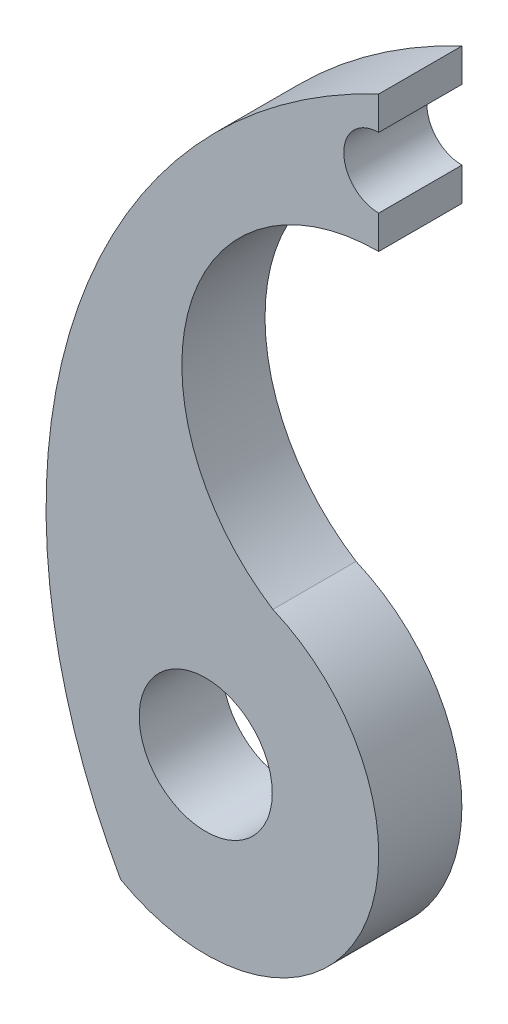
ISO-10303-21;
HEADER;
FILE_DESCRIPTION(('STEP AP214'),'2;1');
FILE_NAME('part.step','',(''),(''),'','','');
FILE_SCHEMA(('AUTOMOTIVE_DESIGN { 1 0 10303 214 1 1 1 1 }'));
ENDSEC;
DATA;
#1=APPLICATION_CONTEXT('core data for automotive mechanical design processes');
#2=APPLICATION_PROTOCOL_DEFINITION('international standard','automotive_design',2000,#1);
#3=PRODUCT_CONTEXT('',#1,'mechanical');
#4=PRODUCT('Part','Part','',(#3));
#5=PRODUCT_RELATED_PRODUCT_CATEGORY('part','',(#4));
#6=PRODUCT_DEFINITION_FORMATION('','',#4);
#7=PRODUCT_DEFINITION_CONTEXT('part definition',#1,'design');
#8=PRODUCT_DEFINITION('design','',#6,#7);
#9=PRODUCT_DEFINITION_SHAPE('','',#8);
#10=(LENGTH_UNIT() NAMED_UNIT(*) SI_UNIT(.MILLI.,.METRE.));
#11=(NAMED_UNIT(*) PLANE_ANGLE_UNIT() SI_UNIT($,.RADIAN.));
#12=(NAMED_UNIT(*) SI_UNIT($,.STERADIAN.) SOLID_ANGLE_UNIT());
#13=UNCERTAINTY_MEASURE_WITH_UNIT(LENGTH_MEASURE(1.E-05),#10,'distance_accuracy_value','');
#14=(GEOMETRIC_REPRESENTATION_CONTEXT(3) GLOBAL_UNCERTAINTY_ASSIGNED_CONTEXT((#13)) GLOBAL_UNIT_ASSIGNED_CONTEXT((#10,
#11,#12)) REPRESENTATION_CONTEXT('',''));
#15=CARTESIAN_POINT('',(0.,0.,0.));
#16=DIRECTION('',(0.,0.,1.));
#17=DIRECTION('',(1.,0.,0.));
#18=AXIS2_PLACEMENT_3D('',#15,#16,#17);
#19=CARTESIAN_POINT('',(9.45278155463974,11.7152638777585,3.175));
#20=DIRECTION('',(0.,0.,1.));
#21=DIRECTION('',(1.,0.,0.));
#22=AXIS2_PLACEMENT_3D('',#19,#20,#21);
#23=PLANE('',#22);
#24=CARTESIAN_POINT('',(9.45278155463974,11.7152638777585,3.175));
#25=DIRECTION('',(0.,0.,1.));
#26=DIRECTION('',(1.,0.,0.));
#27=AXIS2_PLACEMENT_3D('',#24,#25,#26);
#28=CIRCLE('',#27,22.1527815546397);
#29=CARTESIAN_POINT('',(0.,31.75,3.175));
#30=VERTEX_POINT('',#29);
#31=CARTESIAN_POINT('',(-9.85589421673466,0.856130829327474,3.175));
#32=VERTEX_POINT('',#31);
#33=EDGE_CURVE('E128',#30,#32,#28,.T.);
#34=ORIENTED_EDGE('',*,*,#33,.T.);
#35=CARTESIAN_POINT('',(-6.604,6.604,3.175));
#36=DIRECTION('',(0.,0.,1.));
#37=DIRECTION('',(1.,0.,0.));
#38=AXIS2_PLACEMENT_3D('',#35,#36,#37);
#39=CIRCLE('',#38,6.604);
#40=CARTESIAN_POINT('',(-4.04044583348446,12.6901322722515,3.175));
#41=VERTEX_POINT('',#40);
#42=EDGE_CURVE('E86',#32,#41,#39,.T.);
#43=ORIENTED_EDGE('',*,*,#42,.T.);
#44=CARTESIAN_POINT('',(0.,19.0273306487825,3.175));
#45=DIRECTION('',(0.,0.,-1.));
#46=DIRECTION('',(1.,0.,0.));
#47=AXIS2_PLACEMENT_3D('',#44,#45,#46);
#48=CIRCLE('',#47,7.51566935121748);
#49=CARTESIAN_POINT('',(0.,26.543,3.175));
#50=VERTEX_POINT('',#49);
#51=EDGE_CURVE('E99',#41,#50,#48,.T.);
#52=ORIENTED_EDGE('',*,*,#51,.T.);
#53=DIRECTION('',(0.,1.,0.));
#54=VECTOR('',#53,1.);
#55=CARTESIAN_POINT('',(0.,27.813,3.175));
#56=LINE('',#55,#54);
#57=CARTESIAN_POINT('',(0.,27.813,3.175));
#58=VERTEX_POINT('',#57);
#59=EDGE_CURVE('E93',#50,#58,#56,.T.);
#60=ORIENTED_EDGE('',*,*,#59,.T.);
#61=CARTESIAN_POINT('',(0.,29.1465,3.175));
#62=DIRECTION('',(0.,0.,-1.));
#63=DIRECTION('',(1.,0.,0.));
#64=AXIS2_PLACEMENT_3D('',#61,#62,#63);
#65=CIRCLE('',#64,1.3335);
#66=CARTESIAN_POINT('',(0.,30.48,3.175));
#67=VERTEX_POINT('',#66);
#68=EDGE_CURVE('E97',#58,#67,#65,.T.);
#69=ORIENTED_EDGE('',*,*,#68,.T.);
#70=DIRECTION('',(0.,1.,0.));
#71=VECTOR('',#70,1.);
#72=CARTESIAN_POINT('',(0.,30.48,3.175));
#73=LINE('',#72,#71);
#74=EDGE_CURVE('E49',#67,#30,#73,.T.);
#75=ORIENTED_EDGE('',*,*,#74,.T.);
#76=EDGE_LOOP('',(#34,#43,#52,#60,#69,#75));
#77=FACE_BOUND('',#76,.T.);
#78=CARTESIAN_POINT('',(-6.604,6.604,3.175));
#79=DIRECTION('',(0.,0.,1.));
#80=DIRECTION('',(1.,0.,0.));
#81=AXIS2_PLACEMENT_3D('',#78,#79,#80);
#82=CIRCLE('',#81,2.54);
#83=CARTESIAN_POINT('',(-4.064,6.604,3.175));
#84=VERTEX_POINT('',#83);
#85=EDGE_CURVE('E121',#84,#84,#82,.T.);
#86=ORIENTED_EDGE('',*,*,#85,.F.);
#87=EDGE_LOOP('',(#86));
#88=FACE_BOUND('',#87,.T.);
#89=ADVANCED_FACE('F32',(#77,#88),#23,.T.);
#90=CARTESIAN_POINT('',(9.45278155463974,11.7152638777585,0.));
#91=DIRECTION('',(0.,0.,1.));
#92=DIRECTION('',(1.,0.,0.));
#93=AXIS2_PLACEMENT_3D('',#90,#91,#92);
#94=PLANE('',#93);
#95=CARTESIAN_POINT('',(9.45278155463974,11.7152638777585,0.));
#96=DIRECTION('',(0.,0.,1.));
#97=DIRECTION('',(1.,0.,0.));
#98=AXIS2_PLACEMENT_3D('',#95,#96,#97);
#99=CIRCLE('',#98,22.1527815546397);
#100=CARTESIAN_POINT('',(0.,31.75,0.));
#101=VERTEX_POINT('',#100);
#102=CARTESIAN_POINT('',(-9.85589421673466,0.856130829327474,0.));
#103=VERTEX_POINT('',#102);
#104=EDGE_CURVE('E117',#101,#103,#99,.T.);
#105=ORIENTED_EDGE('',*,*,#104,.F.);
#106=DIRECTION('',(0.,1.,0.));
#107=VECTOR('',#106,1.);
#108=CARTESIAN_POINT('',(0.,30.48,0.));
#109=LINE('',#108,#107);
#110=CARTESIAN_POINT('',(0.,30.48,0.));
#111=VERTEX_POINT('',#110);
#112=EDGE_CURVE('E78',#111,#101,#109,.T.);
#113=ORIENTED_EDGE('',*,*,#112,.F.);
#114=CARTESIAN_POINT('',(0.,29.1465,0.));
#115=DIRECTION('',(0.,0.,-1.));
#116=DIRECTION('',(1.,0.,0.));
#117=AXIS2_PLACEMENT_3D('',#114,#115,#116);
#118=CIRCLE('',#117,1.3335);
#119=CARTESIAN_POINT('',(0.,27.813,0.));
#120=VERTEX_POINT('',#119);
#121=EDGE_CURVE('E72',#120,#111,#118,.T.);
#122=ORIENTED_EDGE('',*,*,#121,.F.);
#123=DIRECTION('',(0.,1.,0.));
#124=VECTOR('',#123,1.);
#125=CARTESIAN_POINT('',(0.,27.813,0.));
#126=LINE('',#125,#124);
#127=CARTESIAN_POINT('',(0.,26.543,0.));
#128=VERTEX_POINT('',#127);
#129=EDGE_CURVE('E107',#128,#120,#126,.T.);
#130=ORIENTED_EDGE('',*,*,#129,.F.);
#131=CARTESIAN_POINT('',(0.,19.0273306487825,0.));
#132=DIRECTION('',(0.,0.,-1.));
#133=DIRECTION('',(1.,0.,0.));
#134=AXIS2_PLACEMENT_3D('',#131,#132,#133);
#135=CIRCLE('',#134,7.51566935121748);
#136=CARTESIAN_POINT('',(-4.04044583348446,12.6901322722515,0.));
#137=VERTEX_POINT('',#136);
#138=EDGE_CURVE('E123',#137,#128,#135,.T.);
#139=ORIENTED_EDGE('',*,*,#138,.F.);
#140=CARTESIAN_POINT('',(-6.604,6.604,0.));
#141=DIRECTION('',(0.,0.,1.));
#142=DIRECTION('',(1.,0.,0.));
#143=AXIS2_PLACEMENT_3D('',#140,#141,#142);
#144=CIRCLE('',#143,6.604);
#145=EDGE_CURVE('E120',#103,#137,#144,.T.);
#146=ORIENTED_EDGE('',*,*,#145,.F.);
#147=EDGE_LOOP('',(#105,#113,#122,#130,#139,#146));
#148=FACE_BOUND('',#147,.T.);
#149=CARTESIAN_POINT('',(-6.604,6.604,0.));
#150=DIRECTION('',(0.,0.,1.));
#151=DIRECTION('',(1.,0.,0.));
#152=AXIS2_PLACEMENT_3D('',#149,#150,#151);
#153=CIRCLE('',#152,2.54);
#154=CARTESIAN_POINT('',(-4.064,6.604,0.));
#155=VERTEX_POINT('',#154);
#156=EDGE_CURVE('E221',#155,#155,#153,.T.);
#157=ORIENTED_EDGE('',*,*,#156,.T.);
#158=EDGE_LOOP('',(#157));
#159=FACE_BOUND('',#158,.T.);
#160=ADVANCED_FACE('F137',(#148,#159),#94,.F.);
#161=CARTESIAN_POINT('',(9.45278155463974,11.7152638777585,3.175));
#162=DIRECTION('',(0.,0.,-1.));
#163=DIRECTION('',(-1.,0.,0.));
#164=AXIS2_PLACEMENT_3D('',#161,#162,#163);
#165=CYLINDRICAL_SURFACE('',#164,22.1527815546397);
#166=ORIENTED_EDGE('',*,*,#104,.T.);
#167=DIRECTION('',(0.,0.,-1.));
#168=VECTOR('',#167,1.);
#169=CARTESIAN_POINT('',(-9.85589421673466,0.856130829327474,3.175));
#170=LINE('',#169,#168);
#171=EDGE_CURVE('E11',#32,#103,#170,.T.);
#172=ORIENTED_EDGE('',*,*,#171,.F.);
#173=ORIENTED_EDGE('',*,*,#33,.F.);
#174=DIRECTION('',(0.,0.,-1.));
#175=VECTOR('',#174,1.);
#176=CARTESIAN_POINT('',(0.,31.75,3.175));
#177=LINE('',#176,#175);
#178=EDGE_CURVE('E113',#30,#101,#177,.T.);
#179=ORIENTED_EDGE('',*,*,#178,.T.);
#180=EDGE_LOOP('',(#166,#172,#173,#179));
#181=FACE_BOUND('',#180,.T.);
#182=ADVANCED_FACE('F34',(#181),#165,.T.);
#183=CARTESIAN_POINT('',(-6.604,6.604,3.175));
#184=DIRECTION('',(0.,0.,-1.));
#185=DIRECTION('',(-1.,0.,0.));
#186=AXIS2_PLACEMENT_3D('',#183,#184,#185);
#187=CYLINDRICAL_SURFACE('',#186,6.604);
#188=ORIENTED_EDGE('',*,*,#145,.T.);
#189=DIRECTION('',(0.,0.,-1.));
#190=VECTOR('',#189,1.);
#191=CARTESIAN_POINT('',(-4.04044583348446,12.6901322722515,3.175));
#192=LINE('',#191,#190);
#193=EDGE_CURVE('E41',#41,#137,#192,.T.);
#194=ORIENTED_EDGE('',*,*,#193,.F.);
#195=ORIENTED_EDGE('',*,*,#42,.F.);
#196=ORIENTED_EDGE('',*,*,#171,.T.);
#197=EDGE_LOOP('',(#188,#194,#195,#196));
#198=FACE_BOUND('',#197,.T.);
#199=ADVANCED_FACE('F162',(#198),#187,.T.);
#200=CARTESIAN_POINT('',(0.,19.0273306487825,3.175));
#201=DIRECTION('',(0.,0.,-1.));
#202=DIRECTION('',(-1.,0.,0.));
#203=AXIS2_PLACEMENT_3D('',#200,#201,#202);
#204=CYLINDRICAL_SURFACE('',#203,7.51566935121748);
#205=ORIENTED_EDGE('',*,*,#138,.T.);
#206=DIRECTION('',(0.,0.,-1.));
#207=VECTOR('',#206,1.);
#208=CARTESIAN_POINT('',(0.,26.543,3.175));
#209=LINE('',#208,#207);
#210=EDGE_CURVE('E108',#50,#128,#209,.T.);
#211=ORIENTED_EDGE('',*,*,#210,.F.);
#212=ORIENTED_EDGE('',*,*,#51,.F.);
#213=ORIENTED_EDGE('',*,*,#193,.T.);
#214=EDGE_LOOP('',(#205,#211,#212,#213));
#215=FACE_BOUND('',#214,.T.);
#216=ADVANCED_FACE('F134',(#215),#204,.F.);
#217=CARTESIAN_POINT('',(0.,27.813,3.175));
#218=DIRECTION('',(-1.,0.,0.));
#219=DIRECTION('',(0.,0.,1.));
#220=AXIS2_PLACEMENT_3D('',#217,#218,#219);
#221=PLANE('',#220);
#222=ORIENTED_EDGE('',*,*,#129,.T.);
#223=DIRECTION('',(0.,0.,-1.));
#224=VECTOR('',#223,1.);
#225=CARTESIAN_POINT('',(0.,27.813,3.175));
#226=LINE('',#225,#224);
#227=EDGE_CURVE('E104',#58,#120,#226,.T.);
#228=ORIENTED_EDGE('',*,*,#227,.F.);
#229=ORIENTED_EDGE('',*,*,#59,.F.);
#230=ORIENTED_EDGE('',*,*,#210,.T.);
#231=EDGE_LOOP('',(#222,#228,#229,#230));
#232=FACE_BOUND('',#231,.T.);
#233=ADVANCED_FACE('F105',(#232),#221,.F.);
#234=CARTESIAN_POINT('',(0.,29.1465,3.175));
#235=DIRECTION('',(0.,0.,-1.));
#236=DIRECTION('',(-1.,0.,0.));
#237=AXIS2_PLACEMENT_3D('',#234,#235,#236);
#238=CYLINDRICAL_SURFACE('',#237,1.3335);
#239=ORIENTED_EDGE('',*,*,#121,.T.);
#240=DIRECTION('',(0.,0.,-1.));
#241=VECTOR('',#240,1.);
#242=CARTESIAN_POINT('',(0.,30.48,3.175));
#243=LINE('',#242,#241);
#244=EDGE_CURVE('E109',#67,#111,#243,.T.);
#245=ORIENTED_EDGE('',*,*,#244,.F.);
#246=ORIENTED_EDGE('',*,*,#68,.F.);
#247=ORIENTED_EDGE('',*,*,#227,.T.);
#248=EDGE_LOOP('',(#239,#245,#246,#247));
#249=FACE_BOUND('',#248,.T.);
#250=ADVANCED_FACE('F111',(#249),#238,.F.);
#251=CARTESIAN_POINT('',(0.,30.48,3.175));
#252=DIRECTION('',(-1.,0.,0.));
#253=DIRECTION('',(0.,0.,1.));
#254=AXIS2_PLACEMENT_3D('',#251,#252,#253);
#255=PLANE('',#254);
#256=ORIENTED_EDGE('',*,*,#112,.T.);
#257=ORIENTED_EDGE('',*,*,#178,.F.);
#258=ORIENTED_EDGE('',*,*,#74,.F.);
#259=ORIENTED_EDGE('',*,*,#244,.T.);
#260=EDGE_LOOP('',(#256,#257,#258,#259));
#261=FACE_BOUND('',#260,.T.);
#262=ADVANCED_FACE('F142',(#261),#255,.F.);
#263=CARTESIAN_POINT('',(-6.604,6.604,3.175));
#264=DIRECTION('',(0.,0.,-1.));
#265=DIRECTION('',(-1.,0.,0.));
#266=AXIS2_PLACEMENT_3D('',#263,#264,#265);
#267=CYLINDRICAL_SURFACE('',#266,2.54);
#268=ORIENTED_EDGE('',*,*,#85,.T.);
#269=EDGE_LOOP('',(#268));
#270=FACE_BOUND('',#269,.T.);
#271=ORIENTED_EDGE('',*,*,#156,.F.);
#272=EDGE_LOOP('',(#271));
#273=FACE_BOUND('',#272,.T.);
#274=ADVANCED_FACE('F144',(#270,#273),#267,.F.);
#275=CLOSED_SHELL('',(#89,#160,#182,#199,#216,#233,#250,#262,#274));
#276=MANIFOLD_SOLID_BREP('B2',#275);
#277=ADVANCED_BREP_SHAPE_REPRESENTATION('',(#18,#276),#14);
#278=SHAPE_DEFINITION_REPRESENTATION(#9,#277);
ENDSEC;
END-ISO-10303-21;
